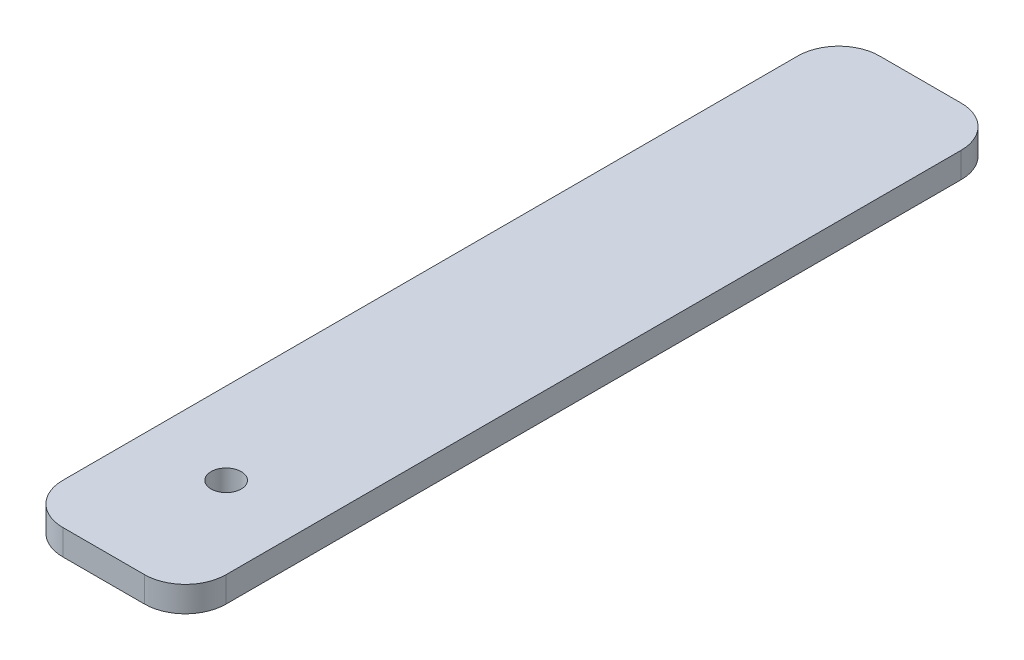
ISO-10303-21;
HEADER;
FILE_DESCRIPTION(('STEP AP214'),'2;1');
FILE_NAME('part.step','',(''),(''),'','','');
FILE_SCHEMA(('AUTOMOTIVE_DESIGN { 1 0 10303 214 1 1 1 1 }'));
ENDSEC;
DATA;
#1=APPLICATION_CONTEXT('core data for automotive mechanical design processes');
#2=APPLICATION_PROTOCOL_DEFINITION('international standard','automotive_design',2000,#1);
#3=PRODUCT_CONTEXT('',#1,'mechanical');
#4=PRODUCT('Part','Part','',(#3));
#5=PRODUCT_RELATED_PRODUCT_CATEGORY('part','',(#4));
#6=PRODUCT_DEFINITION_FORMATION('','',#4);
#7=PRODUCT_DEFINITION_CONTEXT('part definition',#1,'design');
#8=PRODUCT_DEFINITION('design','',#6,#7);
#9=PRODUCT_DEFINITION_SHAPE('','',#8);
#10=(LENGTH_UNIT() NAMED_UNIT(*) SI_UNIT(.MILLI.,.METRE.));
#11=(NAMED_UNIT(*) PLANE_ANGLE_UNIT() SI_UNIT($,.RADIAN.));
#12=(NAMED_UNIT(*) SI_UNIT($,.STERADIAN.) SOLID_ANGLE_UNIT());
#13=UNCERTAINTY_MEASURE_WITH_UNIT(LENGTH_MEASURE(1.E-05),#10,'distance_accuracy_value','');
#14=(GEOMETRIC_REPRESENTATION_CONTEXT(3) GLOBAL_UNCERTAINTY_ASSIGNED_CONTEXT((#13)) GLOBAL_UNIT_ASSIGNED_CONTEXT((#10,
#11,#12)) REPRESENTATION_CONTEXT('',''));
#15=CARTESIAN_POINT('',(0.,0.,0.));
#16=DIRECTION('',(0.,0.,1.));
#17=DIRECTION('',(1.,0.,0.));
#18=AXIS2_PLACEMENT_3D('',#15,#16,#17);
#19=CARTESIAN_POINT('',(0.,1.5875,0.));
#20=DIRECTION('',(0.,-1.,0.));
#21=DIRECTION('',(0.,0.,-1.));
#22=AXIS2_PLACEMENT_3D('',#19,#20,#21);
#23=PLANE('',#22);
#24=DIRECTION('',(-1.,0.,0.));
#25=VECTOR('',#24,1.);
#26=CARTESIAN_POINT('',(0.,1.5875,-50.8));
#27=LINE('',#26,#25);
#28=CARTESIAN_POINT('',(7.62,1.5875,-50.8));
#29=VERTEX_POINT('',#28);
#30=CARTESIAN_POINT('',(2.54,1.5875,-50.8));
#31=VERTEX_POINT('',#30);
#32=EDGE_CURVE('E136',#29,#31,#27,.T.);
#33=ORIENTED_EDGE('',*,*,#32,.T.);
#34=CARTESIAN_POINT('',(2.54,1.5875,-48.26));
#35=DIRECTION('',(0.,-1.,0.));
#36=DIRECTION('',(0.,0.,-1.));
#37=AXIS2_PLACEMENT_3D('',#34,#35,#36);
#38=CIRCLE('',#37,2.54);
#39=CARTESIAN_POINT('',(0.,1.5875,-48.26));
#40=VERTEX_POINT('',#39);
#41=EDGE_CURVE('E155',#31,#40,#38,.F.);
#42=ORIENTED_EDGE('',*,*,#41,.T.);
#43=DIRECTION('',(0.,0.,1.));
#44=VECTOR('',#43,1.);
#45=CARTESIAN_POINT('',(0.,1.5875,0.));
#46=LINE('',#45,#44);
#47=CARTESIAN_POINT('',(0.,1.5875,-2.54));
#48=VERTEX_POINT('',#47);
#49=EDGE_CURVE('E119',#40,#48,#46,.T.);
#50=ORIENTED_EDGE('',*,*,#49,.T.);
#51=CARTESIAN_POINT('',(2.54,1.5875,-2.54));
#52=DIRECTION('',(0.,-1.,0.));
#53=DIRECTION('',(0.,0.,-1.));
#54=AXIS2_PLACEMENT_3D('',#51,#52,#53);
#55=CIRCLE('',#54,2.54);
#56=CARTESIAN_POINT('',(2.54,1.5875,0.));
#57=VERTEX_POINT('',#56);
#58=EDGE_CURVE('E150',#48,#57,#55,.F.);
#59=ORIENTED_EDGE('',*,*,#58,.T.);
#60=DIRECTION('',(1.,0.,0.));
#61=VECTOR('',#60,1.);
#62=CARTESIAN_POINT('',(0.,1.5875,0.));
#63=LINE('',#62,#61);
#64=CARTESIAN_POINT('',(7.62,1.5875,0.));
#65=VERTEX_POINT('',#64);
#66=EDGE_CURVE('E166',#57,#65,#63,.T.);
#67=ORIENTED_EDGE('',*,*,#66,.T.);
#68=CARTESIAN_POINT('',(7.62,1.5875,-2.54));
#69=DIRECTION('',(0.,-1.,0.));
#70=DIRECTION('',(0.,0.,-1.));
#71=AXIS2_PLACEMENT_3D('',#68,#69,#70);
#72=CIRCLE('',#71,2.54);
#73=CARTESIAN_POINT('',(10.16,1.5875,-2.54));
#74=VERTEX_POINT('',#73);
#75=EDGE_CURVE('E55',#65,#74,#72,.F.);
#76=ORIENTED_EDGE('',*,*,#75,.T.);
#77=DIRECTION('',(0.,0.,-1.));
#78=VECTOR('',#77,1.);
#79=CARTESIAN_POINT('',(10.16,1.5875,0.));
#80=LINE('',#79,#78);
#81=CARTESIAN_POINT('',(10.16,1.5875,-48.26));
#82=VERTEX_POINT('',#81);
#83=EDGE_CURVE('E174',#74,#82,#80,.T.);
#84=ORIENTED_EDGE('',*,*,#83,.T.);
#85=CARTESIAN_POINT('',(7.62,1.5875,-48.26));
#86=DIRECTION('',(0.,-1.,0.));
#87=DIRECTION('',(0.,0.,-1.));
#88=AXIS2_PLACEMENT_3D('',#85,#86,#87);
#89=CIRCLE('',#88,2.54);
#90=EDGE_CURVE('E153',#82,#29,#89,.F.);
#91=ORIENTED_EDGE('',*,*,#90,.T.);
#92=EDGE_LOOP('',(#33,#42,#50,#59,#67,#76,#84,#91));
#93=FACE_BOUND('',#92,.T.);
#94=CARTESIAN_POINT('',(5.08,1.5875,-7.62));
#95=DIRECTION('',(0.,1.,0.));
#96=DIRECTION('',(0.,0.,1.));
#97=AXIS2_PLACEMENT_3D('',#94,#95,#96);
#98=CIRCLE('',#97,0.939800000000001);
#99=CARTESIAN_POINT('',(5.08,1.5875,-6.6802));
#100=VERTEX_POINT('',#99);
#101=EDGE_CURVE('E127',#100,#100,#98,.T.);
#102=ORIENTED_EDGE('',*,*,#101,.F.);
#103=EDGE_LOOP('',(#102));
#104=FACE_BOUND('',#103,.T.);
#105=ADVANCED_FACE('F33',(#93,#104),#23,.F.);
#106=CARTESIAN_POINT('',(0.,0.,0.));
#107=DIRECTION('',(0.,-1.,0.));
#108=DIRECTION('',(0.,0.,-1.));
#109=AXIS2_PLACEMENT_3D('',#106,#107,#108);
#110=PLANE('',#109);
#111=DIRECTION('',(0.,0.,1.));
#112=VECTOR('',#111,1.);
#113=CARTESIAN_POINT('',(0.,0.,0.));
#114=LINE('',#113,#112);
#115=CARTESIAN_POINT('',(0.,0.,-48.26));
#116=VERTEX_POINT('',#115);
#117=CARTESIAN_POINT('',(0.,0.,-2.54));
#118=VERTEX_POINT('',#117);
#119=EDGE_CURVE('E116',#116,#118,#114,.T.);
#120=ORIENTED_EDGE('',*,*,#119,.F.);
#121=CARTESIAN_POINT('',(2.54,0.,-48.26));
#122=DIRECTION('',(0.,-1.,0.));
#123=DIRECTION('',(0.,0.,-1.));
#124=AXIS2_PLACEMENT_3D('',#121,#122,#123);
#125=CIRCLE('',#124,2.54);
#126=CARTESIAN_POINT('',(2.54,0.,-50.8));
#127=VERTEX_POINT('',#126);
#128=EDGE_CURVE('E99',#116,#127,#125,.T.);
#129=ORIENTED_EDGE('',*,*,#128,.T.);
#130=DIRECTION('',(-1.,0.,0.));
#131=VECTOR('',#130,1.);
#132=CARTESIAN_POINT('',(0.,0.,-50.8));
#133=LINE('',#132,#131);
#134=CARTESIAN_POINT('',(7.62,0.,-50.8));
#135=VERTEX_POINT('',#134);
#136=EDGE_CURVE('E140',#135,#127,#133,.T.);
#137=ORIENTED_EDGE('',*,*,#136,.F.);
#138=CARTESIAN_POINT('',(7.62,0.,-48.26));
#139=DIRECTION('',(0.,-1.,0.));
#140=DIRECTION('',(0.,0.,-1.));
#141=AXIS2_PLACEMENT_3D('',#138,#139,#140);
#142=CIRCLE('',#141,2.54);
#143=CARTESIAN_POINT('',(10.16,0.,-48.26));
#144=VERTEX_POINT('',#143);
#145=EDGE_CURVE('E110',#135,#144,#142,.T.);
#146=ORIENTED_EDGE('',*,*,#145,.T.);
#147=DIRECTION('',(0.,0.,-1.));
#148=VECTOR('',#147,1.);
#149=CARTESIAN_POINT('',(10.16,0.,0.));
#150=LINE('',#149,#148);
#151=CARTESIAN_POINT('',(10.16,0.,-2.54));
#152=VERTEX_POINT('',#151);
#153=EDGE_CURVE('E130',#152,#144,#150,.T.);
#154=ORIENTED_EDGE('',*,*,#153,.F.);
#155=CARTESIAN_POINT('',(7.62,0.,-2.54));
#156=DIRECTION('',(0.,-1.,0.));
#157=DIRECTION('',(0.,0.,-1.));
#158=AXIS2_PLACEMENT_3D('',#155,#156,#157);
#159=CIRCLE('',#158,2.54);
#160=CARTESIAN_POINT('',(7.62,0.,0.));
#161=VERTEX_POINT('',#160);
#162=EDGE_CURVE('E144',#152,#161,#159,.T.);
#163=ORIENTED_EDGE('',*,*,#162,.T.);
#164=DIRECTION('',(1.,0.,0.));
#165=VECTOR('',#164,1.);
#166=CARTESIAN_POINT('',(0.,0.,0.));
#167=LINE('',#166,#165);
#168=CARTESIAN_POINT('',(2.54,0.,0.));
#169=VERTEX_POINT('',#168);
#170=EDGE_CURVE('E126',#169,#161,#167,.T.);
#171=ORIENTED_EDGE('',*,*,#170,.F.);
#172=CARTESIAN_POINT('',(2.54,0.,-2.54));
#173=DIRECTION('',(0.,-1.,0.));
#174=DIRECTION('',(0.,0.,-1.));
#175=AXIS2_PLACEMENT_3D('',#172,#173,#174);
#176=CIRCLE('',#175,2.54);
#177=EDGE_CURVE('E120',#169,#118,#176,.T.);
#178=ORIENTED_EDGE('',*,*,#177,.T.);
#179=EDGE_LOOP('',(#120,#129,#137,#146,#154,#163,#171,#178));
#180=FACE_BOUND('',#179,.T.);
#181=CARTESIAN_POINT('',(5.08,0.,-7.62));
#182=DIRECTION('',(0.,1.,0.));
#183=DIRECTION('',(0.,0.,1.));
#184=AXIS2_PLACEMENT_3D('',#181,#182,#183);
#185=CIRCLE('',#184,0.939800000000001);
#186=CARTESIAN_POINT('',(5.08,0.,-6.6802));
#187=VERTEX_POINT('',#186);
#188=EDGE_CURVE('E133',#187,#187,#185,.T.);
#189=ORIENTED_EDGE('',*,*,#188,.T.);
#190=EDGE_LOOP('',(#189));
#191=FACE_BOUND('',#190,.T.);
#192=ADVANCED_FACE('F123',(#180,#191),#110,.T.);
#193=CARTESIAN_POINT('',(0.,1.5875,0.));
#194=DIRECTION('',(1.,0.,0.));
#195=DIRECTION('',(0.,0.,-1.));
#196=AXIS2_PLACEMENT_3D('',#193,#194,#195);
#197=PLANE('',#196);
#198=ORIENTED_EDGE('',*,*,#49,.F.);
#199=DIRECTION('',(0.,-1.,0.));
#200=VECTOR('',#199,1.);
#201=CARTESIAN_POINT('',(0.,1.5875,-48.26));
#202=LINE('',#201,#200);
#203=EDGE_CURVE('E103',#40,#116,#202,.T.);
#204=ORIENTED_EDGE('',*,*,#203,.T.);
#205=ORIENTED_EDGE('',*,*,#119,.T.);
#206=DIRECTION('',(0.,-1.,0.));
#207=VECTOR('',#206,1.);
#208=CARTESIAN_POINT('',(0.,1.5875,-2.54));
#209=LINE('',#208,#207);
#210=EDGE_CURVE('E121',#118,#48,#209,.F.);
#211=ORIENTED_EDGE('',*,*,#210,.T.);
#212=EDGE_LOOP('',(#198,#204,#205,#211));
#213=FACE_BOUND('',#212,.T.);
#214=ADVANCED_FACE('F115',(#213),#197,.F.);
#215=CARTESIAN_POINT('',(0.,1.5875,0.));
#216=DIRECTION('',(0.,0.,-1.));
#217=DIRECTION('',(-1.,0.,0.));
#218=AXIS2_PLACEMENT_3D('',#215,#216,#217);
#219=PLANE('',#218);
#220=ORIENTED_EDGE('',*,*,#170,.T.);
#221=DIRECTION('',(0.,-1.,0.));
#222=VECTOR('',#221,1.);
#223=CARTESIAN_POINT('',(7.62,1.5875,0.));
#224=LINE('',#223,#222);
#225=EDGE_CURVE('E11',#161,#65,#224,.F.);
#226=ORIENTED_EDGE('',*,*,#225,.T.);
#227=ORIENTED_EDGE('',*,*,#66,.F.);
#228=DIRECTION('',(0.,-1.,0.));
#229=VECTOR('',#228,1.);
#230=CARTESIAN_POINT('',(2.54,1.5875,0.));
#231=LINE('',#230,#229);
#232=EDGE_CURVE('E41',#57,#169,#231,.T.);
#233=ORIENTED_EDGE('',*,*,#232,.T.);
#234=EDGE_LOOP('',(#220,#226,#227,#233));
#235=FACE_BOUND('',#234,.T.);
#236=ADVANCED_FACE('F164',(#235),#219,.F.);
#237=CARTESIAN_POINT('',(10.16,1.5875,0.));
#238=DIRECTION('',(-1.,0.,0.));
#239=DIRECTION('',(0.,0.,1.));
#240=AXIS2_PLACEMENT_3D('',#237,#238,#239);
#241=PLANE('',#240);
#242=ORIENTED_EDGE('',*,*,#153,.T.);
#243=DIRECTION('',(0.,-1.,0.));
#244=VECTOR('',#243,1.);
#245=CARTESIAN_POINT('',(10.16,1.5875,-48.26));
#246=LINE('',#245,#244);
#247=EDGE_CURVE('E48',#144,#82,#246,.F.);
#248=ORIENTED_EDGE('',*,*,#247,.T.);
#249=ORIENTED_EDGE('',*,*,#83,.F.);
#250=DIRECTION('',(0.,-1.,0.));
#251=VECTOR('',#250,1.);
#252=CARTESIAN_POINT('',(10.16,1.5875,-2.54));
#253=LINE('',#252,#251);
#254=EDGE_CURVE('E157',#74,#152,#253,.T.);
#255=ORIENTED_EDGE('',*,*,#254,.T.);
#256=EDGE_LOOP('',(#242,#248,#249,#255));
#257=FACE_BOUND('',#256,.T.);
#258=ADVANCED_FACE('F173',(#257),#241,.F.);
#259=CARTESIAN_POINT('',(0.,1.5875,-50.8));
#260=DIRECTION('',(0.,0.,1.));
#261=DIRECTION('',(1.,0.,0.));
#262=AXIS2_PLACEMENT_3D('',#259,#260,#261);
#263=PLANE('',#262);
#264=ORIENTED_EDGE('',*,*,#136,.T.);
#265=DIRECTION('',(0.,-1.,0.));
#266=VECTOR('',#265,1.);
#267=CARTESIAN_POINT('',(2.54,1.5875,-50.8));
#268=LINE('',#267,#266);
#269=EDGE_CURVE('E104',#127,#31,#268,.F.);
#270=ORIENTED_EDGE('',*,*,#269,.T.);
#271=ORIENTED_EDGE('',*,*,#32,.F.);
#272=DIRECTION('',(0.,-1.,0.));
#273=VECTOR('',#272,1.);
#274=CARTESIAN_POINT('',(7.62,1.5875,-50.8));
#275=LINE('',#274,#273);
#276=EDGE_CURVE('E109',#29,#135,#275,.T.);
#277=ORIENTED_EDGE('',*,*,#276,.T.);
#278=EDGE_LOOP('',(#264,#270,#271,#277));
#279=FACE_BOUND('',#278,.T.);
#280=ADVANCED_FACE('F185',(#279),#263,.F.);
#281=CARTESIAN_POINT('',(5.08,1.5875,-7.62));
#282=DIRECTION('',(0.,-1.,0.));
#283=DIRECTION('',(0.,0.,-1.));
#284=AXIS2_PLACEMENT_3D('',#281,#282,#283);
#285=CYLINDRICAL_SURFACE('',#284,0.939800000000001);
#286=ORIENTED_EDGE('',*,*,#101,.T.);
#287=EDGE_LOOP('',(#286));
#288=FACE_BOUND('',#287,.T.);
#289=ORIENTED_EDGE('',*,*,#188,.F.);
#290=EDGE_LOOP('',(#289));
#291=FACE_BOUND('',#290,.T.);
#292=ADVANCED_FACE('F183',(#288,#291),#285,.F.);
#293=CARTESIAN_POINT('',(2.54,1.5875,-48.26));
#294=DIRECTION('',(0.,-1.,0.));
#295=DIRECTION('',(0.,0.,-1.));
#296=AXIS2_PLACEMENT_3D('',#293,#294,#295);
#297=CYLINDRICAL_SURFACE('',#296,2.54);
#298=ORIENTED_EDGE('',*,*,#41,.F.);
#299=ORIENTED_EDGE('',*,*,#269,.F.);
#300=ORIENTED_EDGE('',*,*,#128,.F.);
#301=ORIENTED_EDGE('',*,*,#203,.F.);
#302=EDGE_LOOP('',(#298,#299,#300,#301));
#303=FACE_BOUND('',#302,.T.);
#304=ADVANCED_FACE('F102',(#303),#297,.T.);
#305=CARTESIAN_POINT('',(7.62,1.5875,-48.26));
#306=DIRECTION('',(0.,-1.,0.));
#307=DIRECTION('',(0.,0.,-1.));
#308=AXIS2_PLACEMENT_3D('',#305,#306,#307);
#309=CYLINDRICAL_SURFACE('',#308,2.54);
#310=ORIENTED_EDGE('',*,*,#90,.F.);
#311=ORIENTED_EDGE('',*,*,#247,.F.);
#312=ORIENTED_EDGE('',*,*,#145,.F.);
#313=ORIENTED_EDGE('',*,*,#276,.F.);
#314=EDGE_LOOP('',(#310,#311,#312,#313));
#315=FACE_BOUND('',#314,.T.);
#316=ADVANCED_FACE('F192',(#315),#309,.T.);
#317=CARTESIAN_POINT('',(7.62,1.5875,-2.54));
#318=DIRECTION('',(0.,-1.,0.));
#319=DIRECTION('',(0.,0.,-1.));
#320=AXIS2_PLACEMENT_3D('',#317,#318,#319);
#321=CYLINDRICAL_SURFACE('',#320,2.54);
#322=ORIENTED_EDGE('',*,*,#75,.F.);
#323=ORIENTED_EDGE('',*,*,#225,.F.);
#324=ORIENTED_EDGE('',*,*,#162,.F.);
#325=ORIENTED_EDGE('',*,*,#254,.F.);
#326=EDGE_LOOP('',(#322,#323,#324,#325));
#327=FACE_BOUND('',#326,.T.);
#328=ADVANCED_FACE('F172',(#327),#321,.T.);
#329=CARTESIAN_POINT('',(2.54,1.5875,-2.54));
#330=DIRECTION('',(0.,-1.,0.));
#331=DIRECTION('',(0.,0.,-1.));
#332=AXIS2_PLACEMENT_3D('',#329,#330,#331);
#333=CYLINDRICAL_SURFACE('',#332,2.54);
#334=ORIENTED_EDGE('',*,*,#58,.F.);
#335=ORIENTED_EDGE('',*,*,#210,.F.);
#336=ORIENTED_EDGE('',*,*,#177,.F.);
#337=ORIENTED_EDGE('',*,*,#232,.F.);
#338=EDGE_LOOP('',(#334,#335,#336,#337));
#339=FACE_BOUND('',#338,.T.);
#340=ADVANCED_FACE('F35',(#339),#333,.T.);
#341=CLOSED_SHELL('',(#105,#192,#214,#236,#258,#280,#292,#304,#316,#328,#340));
#342=MANIFOLD_SOLID_BREP('B2',#341);
#343=ADVANCED_BREP_SHAPE_REPRESENTATION('',(#18,#342),#14);
#344=SHAPE_DEFINITION_REPRESENTATION(#9,#343);
ENDSEC;
END-ISO-10303-21;
